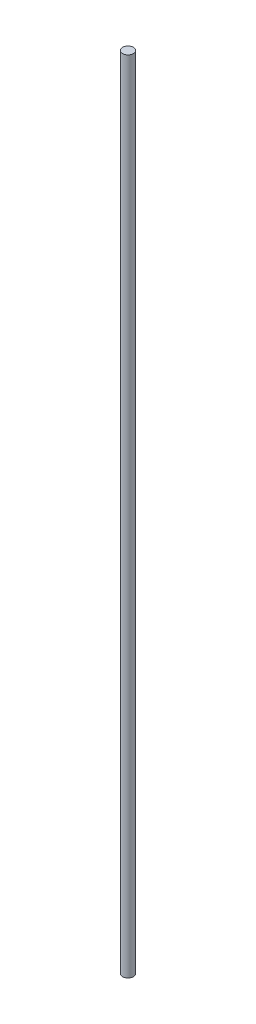
ISO-10303-21;
HEADER;
FILE_DESCRIPTION(('STEP AP214'),'2;1');
FILE_NAME('part.step','',(''),(''),'','','');
FILE_SCHEMA(('AUTOMOTIVE_DESIGN { 1 0 10303 214 1 1 1 1 }'));
ENDSEC;
DATA;
#1=APPLICATION_CONTEXT('core data for automotive mechanical design processes');
#2=APPLICATION_PROTOCOL_DEFINITION('international standard','automotive_design',2000,#1);
#3=PRODUCT_CONTEXT('',#1,'mechanical');
#4=PRODUCT('Part','Part','',(#3));
#5=PRODUCT_RELATED_PRODUCT_CATEGORY('part','',(#4));
#6=PRODUCT_DEFINITION_FORMATION('','',#4);
#7=PRODUCT_DEFINITION_CONTEXT('part definition',#1,'design');
#8=PRODUCT_DEFINITION('design','',#6,#7);
#9=PRODUCT_DEFINITION_SHAPE('','',#8);
#10=(LENGTH_UNIT() NAMED_UNIT(*) SI_UNIT(.MILLI.,.METRE.));
#11=(NAMED_UNIT(*) PLANE_ANGLE_UNIT() SI_UNIT($,.RADIAN.));
#12=(NAMED_UNIT(*) SI_UNIT($,.STERADIAN.) SOLID_ANGLE_UNIT());
#13=UNCERTAINTY_MEASURE_WITH_UNIT(LENGTH_MEASURE(1.E-05),#10,'distance_accuracy_value','');
#14=(GEOMETRIC_REPRESENTATION_CONTEXT(3) GLOBAL_UNCERTAINTY_ASSIGNED_CONTEXT((#13)) GLOBAL_UNIT_ASSIGNED_CONTEXT((#10,
#11,#12)) REPRESENTATION_CONTEXT('',''));
#15=CARTESIAN_POINT('',(0.,0.,0.));
#16=DIRECTION('',(0.,0.,1.));
#17=DIRECTION('',(1.,0.,0.));
#18=AXIS2_PLACEMENT_3D('',#15,#16,#17);
#19=CARTESIAN_POINT('',(0.,600.,0.));
#20=DIRECTION('',(0.,-1.,0.));
#21=DIRECTION('',(0.,0.,-1.));
#22=AXIS2_PLACEMENT_3D('',#19,#20,#21);
#23=CYLINDRICAL_SURFACE('',#22,4.1);
#24=CARTESIAN_POINT('',(0.,600.,0.));
#25=DIRECTION('',(0.,1.,0.));
#26=DIRECTION('',(0.,0.,1.));
#27=AXIS2_PLACEMENT_3D('',#24,#25,#26);
#28=CIRCLE('',#27,4.1);
#29=CARTESIAN_POINT('',(0.,600.,4.1));
#30=VERTEX_POINT('',#29);
#31=EDGE_CURVE('E10',#30,#30,#28,.T.);
#32=ORIENTED_EDGE('',*,*,#31,.F.);
#33=EDGE_LOOP('',(#32));
#34=FACE_BOUND('',#33,.T.);
#35=CARTESIAN_POINT('',(0.,0.,0.));
#36=DIRECTION('',(0.,1.,0.));
#37=DIRECTION('',(0.,0.,1.));
#38=AXIS2_PLACEMENT_3D('',#35,#36,#37);
#39=CIRCLE('',#38,4.1);
#40=CARTESIAN_POINT('',(0.,0.,4.1));
#41=VERTEX_POINT('',#40);
#42=EDGE_CURVE('E37',#41,#41,#39,.T.);
#43=ORIENTED_EDGE('',*,*,#42,.T.);
#44=EDGE_LOOP('',(#43));
#45=FACE_BOUND('',#44,.T.);
#46=ADVANCED_FACE('F34',(#34,#45),#23,.T.);
#47=CARTESIAN_POINT('',(0.,600.,0.));
#48=DIRECTION('',(0.,1.,0.));
#49=DIRECTION('',(0.,0.,1.));
#50=AXIS2_PLACEMENT_3D('',#47,#48,#49);
#51=PLANE('',#50);
#52=ORIENTED_EDGE('',*,*,#31,.T.);
#53=EDGE_LOOP('',(#52));
#54=FACE_BOUND('',#53,.T.);
#55=ADVANCED_FACE('F49',(#54),#51,.T.);
#56=CARTESIAN_POINT('',(0.,0.,0.));
#57=DIRECTION('',(0.,1.,0.));
#58=DIRECTION('',(0.,0.,1.));
#59=AXIS2_PLACEMENT_3D('',#56,#57,#58);
#60=PLANE('',#59);
#61=ORIENTED_EDGE('',*,*,#42,.F.);
#62=EDGE_LOOP('',(#61));
#63=FACE_BOUND('',#62,.T.);
#64=ADVANCED_FACE('F47',(#63),#60,.F.);
#65=CLOSED_SHELL('',(#46,#55,#64));
#66=MANIFOLD_SOLID_BREP('B2',#65);
#67=ADVANCED_BREP_SHAPE_REPRESENTATION('',(#18,#66),#14);
#68=SHAPE_DEFINITION_REPRESENTATION(#9,#67);
ENDSEC;
END-ISO-10303-21;
